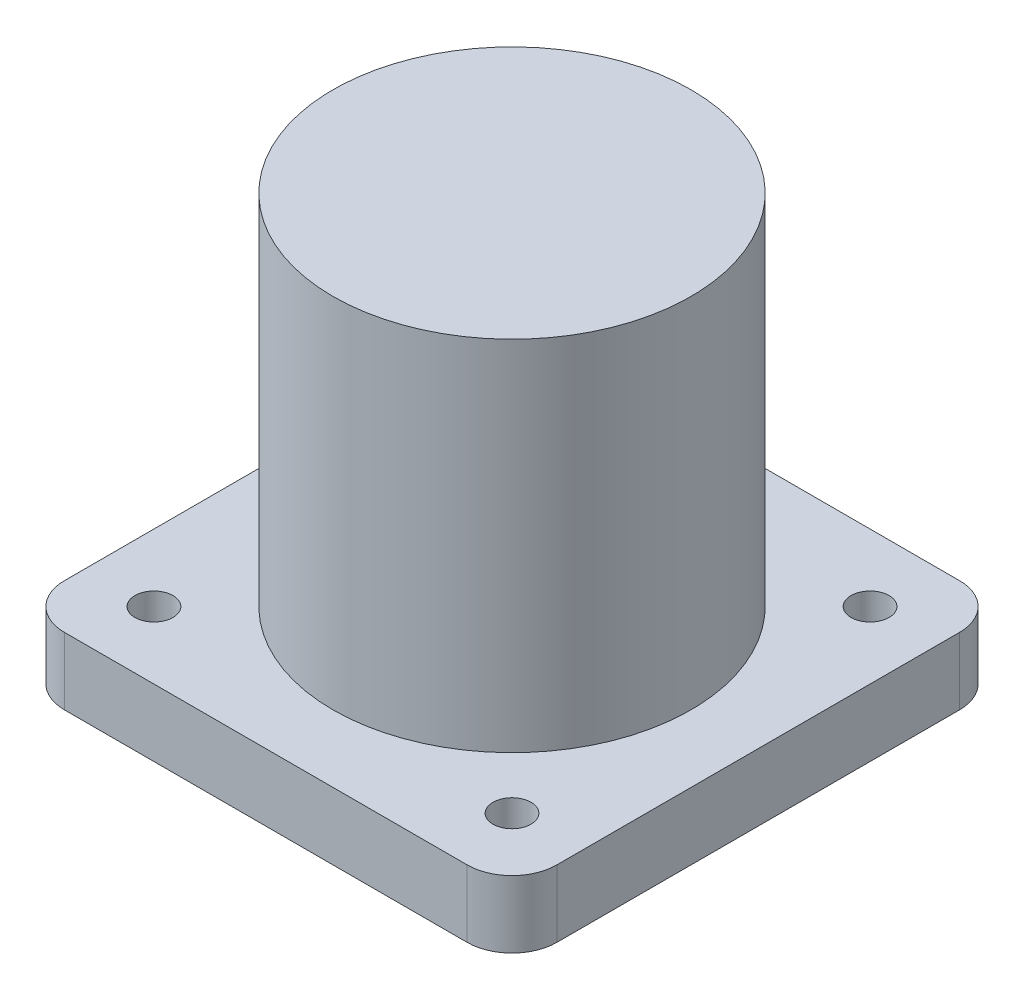
ISO-10303-21;
HEADER;
FILE_DESCRIPTION(('STEP AP214'),'2;1');
FILE_NAME('part.step','',(''),(''),'','','');
FILE_SCHEMA(('AUTOMOTIVE_DESIGN { 1 0 10303 214 1 1 1 1 }'));
ENDSEC;
DATA;
#1=APPLICATION_CONTEXT('core data for automotive mechanical design processes');
#2=APPLICATION_PROTOCOL_DEFINITION('international standard','automotive_design',2000,#1);
#3=PRODUCT_CONTEXT('',#1,'mechanical');
#4=PRODUCT('Part','Part','',(#3));
#5=PRODUCT_RELATED_PRODUCT_CATEGORY('part','',(#4));
#6=PRODUCT_DEFINITION_FORMATION('','',#4);
#7=PRODUCT_DEFINITION_CONTEXT('part definition',#1,'design');
#8=PRODUCT_DEFINITION('design','',#6,#7);
#9=PRODUCT_DEFINITION_SHAPE('','',#8);
#10=(LENGTH_UNIT() NAMED_UNIT(*) SI_UNIT(.MILLI.,.METRE.));
#11=(NAMED_UNIT(*) PLANE_ANGLE_UNIT() SI_UNIT($,.RADIAN.));
#12=(NAMED_UNIT(*) SI_UNIT($,.STERADIAN.) SOLID_ANGLE_UNIT());
#13=UNCERTAINTY_MEASURE_WITH_UNIT(LENGTH_MEASURE(1.E-05),#10,'distance_accuracy_value','');
#14=(GEOMETRIC_REPRESENTATION_CONTEXT(3) GLOBAL_UNCERTAINTY_ASSIGNED_CONTEXT((#13)) GLOBAL_UNIT_ASSIGNED_CONTEXT((#10,
#11,#12)) REPRESENTATION_CONTEXT('',''));
#15=CARTESIAN_POINT('',(0.,0.,0.));
#16=DIRECTION('',(0.,0.,1.));
#17=DIRECTION('',(1.,0.,0.));
#18=AXIS2_PLACEMENT_3D('',#15,#16,#17);
#19=CARTESIAN_POINT('',(-43.7665782493369,15.,-29.6153846153846));
#20=DIRECTION('',(1.,0.,0.));
#21=DIRECTION('',(0.,0.,-1.));
#22=AXIS2_PLACEMENT_3D('',#19,#20,#21);
#23=PLANE('',#22);
#24=DIRECTION('',(0.,0.,1.));
#25=VECTOR('',#24,1.);
#26=CARTESIAN_POINT('',(-43.7665782493369,0.,-29.6153846153846));
#27=LINE('',#26,#25);
#28=CARTESIAN_POINT('',(-43.7665782493369,0.,-19.6153846153846));
#29=VERTEX_POINT('',#28);
#30=CARTESIAN_POINT('',(-43.7665782493369,0.,70.3846153846154));
#31=VERTEX_POINT('',#30);
#32=EDGE_CURVE('E133',#29,#31,#27,.T.);
#33=ORIENTED_EDGE('',*,*,#32,.T.);
#34=DIRECTION('',(0.,-1.,0.));
#35=VECTOR('',#34,1.);
#36=CARTESIAN_POINT('',(-43.7665782493369,15.,70.3846153846154));
#37=LINE('',#36,#35);
#38=CARTESIAN_POINT('',(-43.7665782493369,15.,70.3846153846154));
#39=VERTEX_POINT('',#38);
#40=EDGE_CURVE('E111',#31,#39,#37,.F.);
#41=ORIENTED_EDGE('',*,*,#40,.T.);
#42=DIRECTION('',(0.,0.,1.));
#43=VECTOR('',#42,1.);
#44=CARTESIAN_POINT('',(-43.7665782493369,15.,-29.6153846153846));
#45=LINE('',#44,#43);
#46=CARTESIAN_POINT('',(-43.7665782493369,15.,-19.6153846153846));
#47=VERTEX_POINT('',#46);
#48=EDGE_CURVE('E143',#47,#39,#45,.T.);
#49=ORIENTED_EDGE('',*,*,#48,.F.);
#50=DIRECTION('',(0.,-1.,0.));
#51=VECTOR('',#50,1.);
#52=CARTESIAN_POINT('',(-43.7665782493369,15.,-19.6153846153846));
#53=LINE('',#52,#51);
#54=EDGE_CURVE('E116',#47,#29,#53,.T.);
#55=ORIENTED_EDGE('',*,*,#54,.T.);
#56=EDGE_LOOP('',(#33,#41,#49,#55));
#57=FACE_BOUND('',#56,.T.);
#58=ADVANCED_FACE('F41',(#57),#23,.F.);
#59=CARTESIAN_POINT('',(-43.7665782493369,15.,80.3846153846154));
#60=DIRECTION('',(0.,0.,-1.));
#61=DIRECTION('',(-1.,0.,0.));
#62=AXIS2_PLACEMENT_3D('',#59,#60,#61);
#63=PLANE('',#62);
#64=DIRECTION('',(1.,0.,0.));
#65=VECTOR('',#64,1.);
#66=CARTESIAN_POINT('',(-43.7665782493369,15.,80.3846153846154));
#67=LINE('',#66,#65);
#68=CARTESIAN_POINT('',(-33.7665782493369,15.,80.3846153846154));
#69=VERTEX_POINT('',#68);
#70=CARTESIAN_POINT('',(56.2334217506631,15.,80.3846153846154));
#71=VERTEX_POINT('',#70);
#72=EDGE_CURVE('E126',#69,#71,#67,.T.);
#73=ORIENTED_EDGE('',*,*,#72,.F.);
#74=DIRECTION('',(0.,-1.,0.));
#75=VECTOR('',#74,1.);
#76=CARTESIAN_POINT('',(-33.7665782493369,15.,80.3846153846154));
#77=LINE('',#76,#75);
#78=CARTESIAN_POINT('',(-33.7665782493369,0.,80.3846153846154));
#79=VERTEX_POINT('',#78);
#80=EDGE_CURVE('E110',#69,#79,#77,.T.);
#81=ORIENTED_EDGE('',*,*,#80,.T.);
#82=DIRECTION('',(1.,0.,0.));
#83=VECTOR('',#82,1.);
#84=CARTESIAN_POINT('',(-43.7665782493369,0.,80.3846153846154));
#85=LINE('',#84,#83);
#86=CARTESIAN_POINT('',(56.2334217506631,0.,80.3846153846154));
#87=VERTEX_POINT('',#86);
#88=EDGE_CURVE('E123',#79,#87,#85,.T.);
#89=ORIENTED_EDGE('',*,*,#88,.T.);
#90=DIRECTION('',(0.,-1.,0.));
#91=VECTOR('',#90,1.);
#92=CARTESIAN_POINT('',(56.2334217506631,15.,80.3846153846154));
#93=LINE('',#92,#91);
#94=EDGE_CURVE('E128',#87,#71,#93,.F.);
#95=ORIENTED_EDGE('',*,*,#94,.T.);
#96=EDGE_LOOP('',(#73,#81,#89,#95));
#97=FACE_BOUND('',#96,.T.);
#98=ADVANCED_FACE('F122',(#97),#63,.F.);
#99=CARTESIAN_POINT('',(66.2334217506631,15.,-29.6153846153846));
#100=DIRECTION('',(-1.,0.,0.));
#101=DIRECTION('',(0.,0.,1.));
#102=AXIS2_PLACEMENT_3D('',#99,#100,#101);
#103=PLANE('',#102);
#104=DIRECTION('',(0.,0.,-1.));
#105=VECTOR('',#104,1.);
#106=CARTESIAN_POINT('',(66.2334217506631,15.,-29.6153846153846));
#107=LINE('',#106,#105);
#108=CARTESIAN_POINT('',(66.2334217506631,15.,70.3846153846154));
#109=VERTEX_POINT('',#108);
#110=CARTESIAN_POINT('',(66.2334217506631,15.,-19.6153846153846));
#111=VERTEX_POINT('',#110);
#112=EDGE_CURVE('E177',#109,#111,#107,.T.);
#113=ORIENTED_EDGE('',*,*,#112,.F.);
#114=DIRECTION('',(0.,-1.,0.));
#115=VECTOR('',#114,1.);
#116=CARTESIAN_POINT('',(66.2334217506631,15.,70.3846153846154));
#117=LINE('',#116,#115);
#118=CARTESIAN_POINT('',(66.2334217506631,0.,70.3846153846154));
#119=VERTEX_POINT('',#118);
#120=EDGE_CURVE('E162',#109,#119,#117,.T.);
#121=ORIENTED_EDGE('',*,*,#120,.T.);
#122=DIRECTION('',(0.,0.,-1.));
#123=VECTOR('',#122,1.);
#124=CARTESIAN_POINT('',(66.2334217506631,0.,-29.6153846153846));
#125=LINE('',#124,#123);
#126=CARTESIAN_POINT('',(66.2334217506631,0.,-19.6153846153846));
#127=VERTEX_POINT('',#126);
#128=EDGE_CURVE('E132',#119,#127,#125,.T.);
#129=ORIENTED_EDGE('',*,*,#128,.T.);
#130=DIRECTION('',(0.,-1.,0.));
#131=VECTOR('',#130,1.);
#132=CARTESIAN_POINT('',(66.2334217506631,15.,-19.6153846153846));
#133=LINE('',#132,#131);
#134=EDGE_CURVE('E160',#127,#111,#133,.F.);
#135=ORIENTED_EDGE('',*,*,#134,.T.);
#136=EDGE_LOOP('',(#113,#121,#129,#135));
#137=FACE_BOUND('',#136,.T.);
#138=ADVANCED_FACE('F194',(#137),#103,.F.);
#139=CARTESIAN_POINT('',(-43.7665782493369,15.,-29.6153846153846));
#140=DIRECTION('',(0.,0.,1.));
#141=DIRECTION('',(1.,0.,0.));
#142=AXIS2_PLACEMENT_3D('',#139,#140,#141);
#143=PLANE('',#142);
#144=DIRECTION('',(-1.,0.,0.));
#145=VECTOR('',#144,1.);
#146=CARTESIAN_POINT('',(-43.7665782493369,0.,-29.6153846153846));
#147=LINE('',#146,#145);
#148=CARTESIAN_POINT('',(56.2334217506631,0.,-29.6153846153846));
#149=VERTEX_POINT('',#148);
#150=CARTESIAN_POINT('',(-33.7665782493369,0.,-29.6153846153846));
#151=VERTEX_POINT('',#150);
#152=EDGE_CURVE('E136',#149,#151,#147,.T.);
#153=ORIENTED_EDGE('',*,*,#152,.T.);
#154=DIRECTION('',(0.,-1.,0.));
#155=VECTOR('',#154,1.);
#156=CARTESIAN_POINT('',(-33.7665782493369,15.,-29.6153846153846));
#157=LINE('',#156,#155);
#158=CARTESIAN_POINT('',(-33.7665782493369,15.,-29.6153846153846));
#159=VERTEX_POINT('',#158);
#160=EDGE_CURVE('E11',#151,#159,#157,.F.);
#161=ORIENTED_EDGE('',*,*,#160,.T.);
#162=DIRECTION('',(-1.,0.,0.));
#163=VECTOR('',#162,1.);
#164=CARTESIAN_POINT('',(-43.7665782493369,15.,-29.6153846153846));
#165=LINE('',#164,#163);
#166=CARTESIAN_POINT('',(56.2334217506631,15.,-29.6153846153846));
#167=VERTEX_POINT('',#166);
#168=EDGE_CURVE('E144',#167,#159,#165,.T.);
#169=ORIENTED_EDGE('',*,*,#168,.F.);
#170=DIRECTION('',(0.,-1.,0.));
#171=VECTOR('',#170,1.);
#172=CARTESIAN_POINT('',(56.2334217506631,15.,-29.6153846153846));
#173=LINE('',#172,#171);
#174=EDGE_CURVE('E49',#167,#149,#173,.T.);
#175=ORIENTED_EDGE('',*,*,#174,.T.);
#176=EDGE_LOOP('',(#153,#161,#169,#175));
#177=FACE_BOUND('',#176,.T.);
#178=ADVANCED_FACE('F167',(#177),#143,.F.);
#179=CARTESIAN_POINT('',(0.,15.,0.));
#180=DIRECTION('',(0.,1.,0.));
#181=DIRECTION('',(0.,0.,1.));
#182=AXIS2_PLACEMENT_3D('',#179,#180,#181);
#183=PLANE('',#182);
#184=CARTESIAN_POINT('',(11.2334217506631,15.,25.3846153846154));
#185=DIRECTION('',(0.,1.,0.));
#186=DIRECTION('',(0.,0.,1.));
#187=AXIS2_PLACEMENT_3D('',#184,#185,#186);
#188=CIRCLE('',#187,40.);
#189=CARTESIAN_POINT('',(11.2334217506631,15.,65.3846153846154));
#190=VERTEX_POINT('',#189);
#191=EDGE_CURVE('E382',#190,#190,#188,.T.);
#192=ORIENTED_EDGE('',*,*,#191,.F.);
#193=EDGE_LOOP('',(#192));
#194=FACE_BOUND('',#193,.T.);
#195=CARTESIAN_POINT('',(-28.7665782493369,15.,-14.6153846153846));
#196=DIRECTION('',(0.,-1.,0.));
#197=DIRECTION('',(0.,0.,-1.));
#198=AXIS2_PLACEMENT_3D('',#195,#196,#197);
#199=CIRCLE('',#198,4.25);
#200=CARTESIAN_POINT('',(-28.7665782493369,15.,-18.8653846153846));
#201=VERTEX_POINT('',#200);
#202=EDGE_CURVE('E393',#201,#201,#199,.T.);
#203=ORIENTED_EDGE('',*,*,#202,.T.);
#204=EDGE_LOOP('',(#203));
#205=FACE_BOUND('',#204,.T.);
#206=CARTESIAN_POINT('',(51.2334217506631,15.,-14.6153846153846));
#207=DIRECTION('',(0.,-1.,0.));
#208=DIRECTION('',(0.,0.,-1.));
#209=AXIS2_PLACEMENT_3D('',#206,#207,#208);
#210=CIRCLE('',#209,4.25);
#211=CARTESIAN_POINT('',(51.2334217506631,15.,-18.8653846153846));
#212=VERTEX_POINT('',#211);
#213=EDGE_CURVE('E387',#212,#212,#210,.T.);
#214=ORIENTED_EDGE('',*,*,#213,.T.);
#215=EDGE_LOOP('',(#214));
#216=FACE_BOUND('',#215,.T.);
#217=CARTESIAN_POINT('',(51.2334217506631,15.,65.3846153846154));
#218=DIRECTION('',(0.,-1.,0.));
#219=DIRECTION('',(0.,0.,-1.));
#220=AXIS2_PLACEMENT_3D('',#217,#218,#219);
#221=CIRCLE('',#220,4.25000000000001);
#222=CARTESIAN_POINT('',(51.2334217506631,15.,61.1346153846154));
#223=VERTEX_POINT('',#222);
#224=EDGE_CURVE('E374',#223,#223,#221,.T.);
#225=ORIENTED_EDGE('',*,*,#224,.T.);
#226=EDGE_LOOP('',(#225));
#227=FACE_BOUND('',#226,.T.);
#228=CARTESIAN_POINT('',(-28.7665782493369,15.,65.3846153846154));
#229=DIRECTION('',(0.,-1.,0.));
#230=DIRECTION('',(0.,0.,-1.));
#231=AXIS2_PLACEMENT_3D('',#228,#229,#230);
#232=CIRCLE('',#231,4.25000000000001);
#233=CARTESIAN_POINT('',(-28.7665782493369,15.,61.1346153846154));
#234=VERTEX_POINT('',#233);
#235=EDGE_CURVE('E138',#234,#234,#232,.T.);
#236=ORIENTED_EDGE('',*,*,#235,.T.);
#237=EDGE_LOOP('',(#236));
#238=FACE_BOUND('',#237,.T.);
#239=ORIENTED_EDGE('',*,*,#48,.T.);
#240=CARTESIAN_POINT('',(-33.7665782493369,15.,70.3846153846154));
#241=DIRECTION('',(0.,1.,0.));
#242=DIRECTION('',(0.,0.,1.));
#243=AXIS2_PLACEMENT_3D('',#240,#241,#242);
#244=CIRCLE('',#243,10.);
#245=EDGE_CURVE('E158',#39,#69,#244,.T.);
#246=ORIENTED_EDGE('',*,*,#245,.T.);
#247=ORIENTED_EDGE('',*,*,#72,.T.);
#248=CARTESIAN_POINT('',(56.2334217506631,15.,70.3846153846154));
#249=DIRECTION('',(0.,1.,0.));
#250=DIRECTION('',(0.,0.,1.));
#251=AXIS2_PLACEMENT_3D('',#248,#249,#250);
#252=CIRCLE('',#251,10.);
#253=EDGE_CURVE('E156',#71,#109,#252,.T.);
#254=ORIENTED_EDGE('',*,*,#253,.T.);
#255=ORIENTED_EDGE('',*,*,#112,.T.);
#256=CARTESIAN_POINT('',(56.2334217506631,15.,-19.6153846153846));
#257=DIRECTION('',(0.,1.,0.));
#258=DIRECTION('',(0.,0.,1.));
#259=AXIS2_PLACEMENT_3D('',#256,#257,#258);
#260=CIRCLE('',#259,10.);
#261=EDGE_CURVE('E61',#111,#167,#260,.T.);
#262=ORIENTED_EDGE('',*,*,#261,.T.);
#263=ORIENTED_EDGE('',*,*,#168,.T.);
#264=CARTESIAN_POINT('',(-33.7665782493369,15.,-19.6153846153846));
#265=DIRECTION('',(0.,1.,0.));
#266=DIRECTION('',(0.,0.,1.));
#267=AXIS2_PLACEMENT_3D('',#264,#265,#266);
#268=CIRCLE('',#267,10.);
#269=EDGE_CURVE('E154',#159,#47,#268,.T.);
#270=ORIENTED_EDGE('',*,*,#269,.T.);
#271=EDGE_LOOP('',(#239,#246,#247,#254,#255,#262,#263,#270));
#272=FACE_BOUND('',#271,.T.);
#273=ADVANCED_FACE('F183',(#194,#205,#216,#227,#238,#272),#183,.T.);
#274=CARTESIAN_POINT('',(0.,0.,0.));
#275=DIRECTION('',(0.,1.,0.));
#276=DIRECTION('',(0.,0.,1.));
#277=AXIS2_PLACEMENT_3D('',#274,#275,#276);
#278=PLANE('',#277);
#279=CARTESIAN_POINT('',(-28.7665782493369,0.,-14.6153846153846));
#280=DIRECTION('',(0.,-1.,0.));
#281=DIRECTION('',(0.,0.,-1.));
#282=AXIS2_PLACEMENT_3D('',#279,#280,#281);
#283=CIRCLE('',#282,4.25);
#284=CARTESIAN_POINT('',(-28.7665782493369,0.,-18.8653846153846));
#285=VERTEX_POINT('',#284);
#286=EDGE_CURVE('E390',#285,#285,#283,.T.);
#287=ORIENTED_EDGE('',*,*,#286,.F.);
#288=EDGE_LOOP('',(#287));
#289=FACE_BOUND('',#288,.T.);
#290=CARTESIAN_POINT('',(51.2334217506631,0.,-14.6153846153846));
#291=DIRECTION('',(0.,-1.,0.));
#292=DIRECTION('',(0.,0.,-1.));
#293=AXIS2_PLACEMENT_3D('',#290,#291,#292);
#294=CIRCLE('',#293,4.25);
#295=CARTESIAN_POINT('',(51.2334217506631,0.,-18.8653846153846));
#296=VERTEX_POINT('',#295);
#297=EDGE_CURVE('E379',#296,#296,#294,.T.);
#298=ORIENTED_EDGE('',*,*,#297,.F.);
#299=EDGE_LOOP('',(#298));
#300=FACE_BOUND('',#299,.T.);
#301=CARTESIAN_POINT('',(51.2334217506631,0.,65.3846153846154));
#302=DIRECTION('',(0.,-1.,0.));
#303=DIRECTION('',(0.,0.,-1.));
#304=AXIS2_PLACEMENT_3D('',#301,#302,#303);
#305=CIRCLE('',#304,4.25000000000001);
#306=CARTESIAN_POINT('',(51.2334217506631,0.,61.1346153846154));
#307=VERTEX_POINT('',#306);
#308=EDGE_CURVE('E372',#307,#307,#305,.T.);
#309=ORIENTED_EDGE('',*,*,#308,.F.);
#310=EDGE_LOOP('',(#309));
#311=FACE_BOUND('',#310,.T.);
#312=CARTESIAN_POINT('',(-28.7665782493369,0.,65.3846153846154));
#313=DIRECTION('',(0.,-1.,0.));
#314=DIRECTION('',(0.,0.,-1.));
#315=AXIS2_PLACEMENT_3D('',#312,#313,#314);
#316=CIRCLE('',#315,4.25000000000001);
#317=CARTESIAN_POINT('',(-28.7665782493369,0.,61.1346153846154));
#318=VERTEX_POINT('',#317);
#319=EDGE_CURVE('E180',#318,#318,#316,.T.);
#320=ORIENTED_EDGE('',*,*,#319,.F.);
#321=EDGE_LOOP('',(#320));
#322=FACE_BOUND('',#321,.T.);
#323=ORIENTED_EDGE('',*,*,#88,.F.);
#324=CARTESIAN_POINT('',(-33.7665782493369,0.,70.3846153846154));
#325=DIRECTION('',(0.,1.,0.));
#326=DIRECTION('',(0.,0.,1.));
#327=AXIS2_PLACEMENT_3D('',#324,#325,#326);
#328=CIRCLE('',#327,10.);
#329=EDGE_CURVE('E106',#79,#31,#328,.F.);
#330=ORIENTED_EDGE('',*,*,#329,.T.);
#331=ORIENTED_EDGE('',*,*,#32,.F.);
#332=CARTESIAN_POINT('',(-33.7665782493369,0.,-19.6153846153846));
#333=DIRECTION('',(0.,1.,0.));
#334=DIRECTION('',(0.,0.,1.));
#335=AXIS2_PLACEMENT_3D('',#332,#333,#334);
#336=CIRCLE('',#335,10.);
#337=EDGE_CURVE('E147',#29,#151,#336,.F.);
#338=ORIENTED_EDGE('',*,*,#337,.T.);
#339=ORIENTED_EDGE('',*,*,#152,.F.);
#340=CARTESIAN_POINT('',(56.2334217506631,0.,-19.6153846153846));
#341=DIRECTION('',(0.,1.,0.));
#342=DIRECTION('',(0.,0.,1.));
#343=AXIS2_PLACEMENT_3D('',#340,#341,#342);
#344=CIRCLE('',#343,10.);
#345=EDGE_CURVE('E127',#149,#127,#344,.F.);
#346=ORIENTED_EDGE('',*,*,#345,.T.);
#347=ORIENTED_EDGE('',*,*,#128,.F.);
#348=CARTESIAN_POINT('',(56.2334217506631,0.,70.3846153846154));
#349=DIRECTION('',(0.,1.,0.));
#350=DIRECTION('',(0.,0.,1.));
#351=AXIS2_PLACEMENT_3D('',#348,#349,#350);
#352=CIRCLE('',#351,10.);
#353=EDGE_CURVE('E117',#119,#87,#352,.F.);
#354=ORIENTED_EDGE('',*,*,#353,.T.);
#355=EDGE_LOOP('',(#323,#330,#331,#338,#339,#346,#347,#354));
#356=FACE_BOUND('',#355,.T.);
#357=ADVANCED_FACE('F130',(#289,#300,#311,#322,#356),#278,.F.);
#358=CARTESIAN_POINT('',(-28.7665782493369,15.,65.3846153846154));
#359=DIRECTION('',(0.,-1.,0.));
#360=DIRECTION('',(0.,0.,-1.));
#361=AXIS2_PLACEMENT_3D('',#358,#359,#360);
#362=CYLINDRICAL_SURFACE('',#361,4.25000000000001);
#363=ORIENTED_EDGE('',*,*,#235,.F.);
#364=EDGE_LOOP('',(#363));
#365=FACE_BOUND('',#364,.T.);
#366=ORIENTED_EDGE('',*,*,#319,.T.);
#367=EDGE_LOOP('',(#366));
#368=FACE_BOUND('',#367,.T.);
#369=ADVANCED_FACE('F191',(#365,#368),#362,.F.);
#370=CARTESIAN_POINT('',(51.2334217506631,15.,65.3846153846154));
#371=DIRECTION('',(0.,-1.,0.));
#372=DIRECTION('',(0.,0.,-1.));
#373=AXIS2_PLACEMENT_3D('',#370,#371,#372);
#374=CYLINDRICAL_SURFACE('',#373,4.25000000000001);
#375=ORIENTED_EDGE('',*,*,#224,.F.);
#376=EDGE_LOOP('',(#375));
#377=FACE_BOUND('',#376,.T.);
#378=ORIENTED_EDGE('',*,*,#308,.T.);
#379=EDGE_LOOP('',(#378));
#380=FACE_BOUND('',#379,.T.);
#381=ADVANCED_FACE('F319',(#377,#380),#374,.F.);
#382=CARTESIAN_POINT('',(51.2334217506631,15.,-14.6153846153846));
#383=DIRECTION('',(0.,-1.,0.));
#384=DIRECTION('',(0.,0.,-1.));
#385=AXIS2_PLACEMENT_3D('',#382,#383,#384);
#386=CYLINDRICAL_SURFACE('',#385,4.25);
#387=ORIENTED_EDGE('',*,*,#213,.F.);
#388=EDGE_LOOP('',(#387));
#389=FACE_BOUND('',#388,.T.);
#390=ORIENTED_EDGE('',*,*,#297,.T.);
#391=EDGE_LOOP('',(#390));
#392=FACE_BOUND('',#391,.T.);
#393=ADVANCED_FACE('F309',(#389,#392),#386,.F.);
#394=CARTESIAN_POINT('',(-28.7665782493369,15.,-14.6153846153846));
#395=DIRECTION('',(0.,-1.,0.));
#396=DIRECTION('',(0.,0.,-1.));
#397=AXIS2_PLACEMENT_3D('',#394,#395,#396);
#398=CYLINDRICAL_SURFACE('',#397,4.25);
#399=ORIENTED_EDGE('',*,*,#202,.F.);
#400=EDGE_LOOP('',(#399));
#401=FACE_BOUND('',#400,.T.);
#402=ORIENTED_EDGE('',*,*,#286,.T.);
#403=EDGE_LOOP('',(#402));
#404=FACE_BOUND('',#403,.T.);
#405=ADVANCED_FACE('F210',(#401,#404),#398,.F.);
#406=CARTESIAN_POINT('',(-33.7665782493369,15.,70.3846153846154));
#407=DIRECTION('',(0.,-1.,0.));
#408=DIRECTION('',(0.,0.,-1.));
#409=AXIS2_PLACEMENT_3D('',#406,#407,#408);
#410=CYLINDRICAL_SURFACE('',#409,10.);
#411=ORIENTED_EDGE('',*,*,#245,.F.);
#412=ORIENTED_EDGE('',*,*,#40,.F.);
#413=ORIENTED_EDGE('',*,*,#329,.F.);
#414=ORIENTED_EDGE('',*,*,#80,.F.);
#415=EDGE_LOOP('',(#411,#412,#413,#414));
#416=FACE_BOUND('',#415,.T.);
#417=ADVANCED_FACE('F109',(#416),#410,.T.);
#418=CARTESIAN_POINT('',(56.2334217506631,15.,70.3846153846154));
#419=DIRECTION('',(0.,-1.,0.));
#420=DIRECTION('',(0.,0.,-1.));
#421=AXIS2_PLACEMENT_3D('',#418,#419,#420);
#422=CYLINDRICAL_SURFACE('',#421,10.);
#423=ORIENTED_EDGE('',*,*,#253,.F.);
#424=ORIENTED_EDGE('',*,*,#94,.F.);
#425=ORIENTED_EDGE('',*,*,#353,.F.);
#426=ORIENTED_EDGE('',*,*,#120,.F.);
#427=EDGE_LOOP('',(#423,#424,#425,#426));
#428=FACE_BOUND('',#427,.T.);
#429=ADVANCED_FACE('F209',(#428),#422,.T.);
#430=CARTESIAN_POINT('',(-33.7665782493369,15.,-19.6153846153846));
#431=DIRECTION('',(0.,-1.,0.));
#432=DIRECTION('',(0.,0.,-1.));
#433=AXIS2_PLACEMENT_3D('',#430,#431,#432);
#434=CYLINDRICAL_SURFACE('',#433,10.);
#435=ORIENTED_EDGE('',*,*,#269,.F.);
#436=ORIENTED_EDGE('',*,*,#160,.F.);
#437=ORIENTED_EDGE('',*,*,#337,.F.);
#438=ORIENTED_EDGE('',*,*,#54,.F.);
#439=EDGE_LOOP('',(#435,#436,#437,#438));
#440=FACE_BOUND('',#439,.T.);
#441=ADVANCED_FACE('F172',(#440),#434,.T.);
#442=CARTESIAN_POINT('',(56.2334217506631,15.,-19.6153846153846));
#443=DIRECTION('',(0.,-1.,0.));
#444=DIRECTION('',(0.,0.,-1.));
#445=AXIS2_PLACEMENT_3D('',#442,#443,#444);
#446=CYLINDRICAL_SURFACE('',#445,10.);
#447=ORIENTED_EDGE('',*,*,#261,.F.);
#448=ORIENTED_EDGE('',*,*,#134,.F.);
#449=ORIENTED_EDGE('',*,*,#345,.F.);
#450=ORIENTED_EDGE('',*,*,#174,.F.);
#451=EDGE_LOOP('',(#447,#448,#449,#450));
#452=FACE_BOUND('',#451,.T.);
#453=ADVANCED_FACE('F43',(#452),#446,.T.);
#454=CARTESIAN_POINT('',(11.2334217506631,95.,25.3846153846154));
#455=DIRECTION('',(0.,-1.,0.));
#456=DIRECTION('',(0.,0.,-1.));
#457=AXIS2_PLACEMENT_3D('',#454,#455,#456);
#458=CYLINDRICAL_SURFACE('',#457,40.);
#459=CARTESIAN_POINT('',(11.2334217506631,95.,25.3846153846154));
#460=DIRECTION('',(0.,1.,0.));
#461=DIRECTION('',(0.,0.,1.));
#462=AXIS2_PLACEMENT_3D('',#459,#460,#461);
#463=CIRCLE('',#462,40.);
#464=CARTESIAN_POINT('',(11.2334217506631,95.,65.3846153846154));
#465=VERTEX_POINT('',#464);
#466=EDGE_CURVE('E395',#465,#465,#463,.T.);
#467=ORIENTED_EDGE('',*,*,#466,.F.);
#468=EDGE_LOOP('',(#467));
#469=FACE_BOUND('',#468,.T.);
#470=ORIENTED_EDGE('',*,*,#191,.T.);
#471=EDGE_LOOP('',(#470));
#472=FACE_BOUND('',#471,.T.);
#473=ADVANCED_FACE('F217',(#469,#472),#458,.T.);
#474=CARTESIAN_POINT('',(11.2334217506631,95.,25.3846153846154));
#475=DIRECTION('',(0.,1.,0.));
#476=DIRECTION('',(0.,0.,1.));
#477=AXIS2_PLACEMENT_3D('',#474,#475,#476);
#478=PLANE('',#477);
#479=ORIENTED_EDGE('',*,*,#466,.T.);
#480=EDGE_LOOP('',(#479));
#481=FACE_BOUND('',#480,.T.);
#482=ADVANCED_FACE('F221',(#481),#478,.T.);
#483=CLOSED_SHELL('',(#58,#98,#138,#178,#273,#357,#369,#381,#393,#405,#417,#429,#441,#453,#473,#482));
#484=MANIFOLD_SOLID_BREP('B2',#483);
#485=ADVANCED_BREP_SHAPE_REPRESENTATION('',(#18,#484),#14);
#486=SHAPE_DEFINITION_REPRESENTATION(#9,#485);
ENDSEC;
END-ISO-10303-21;
